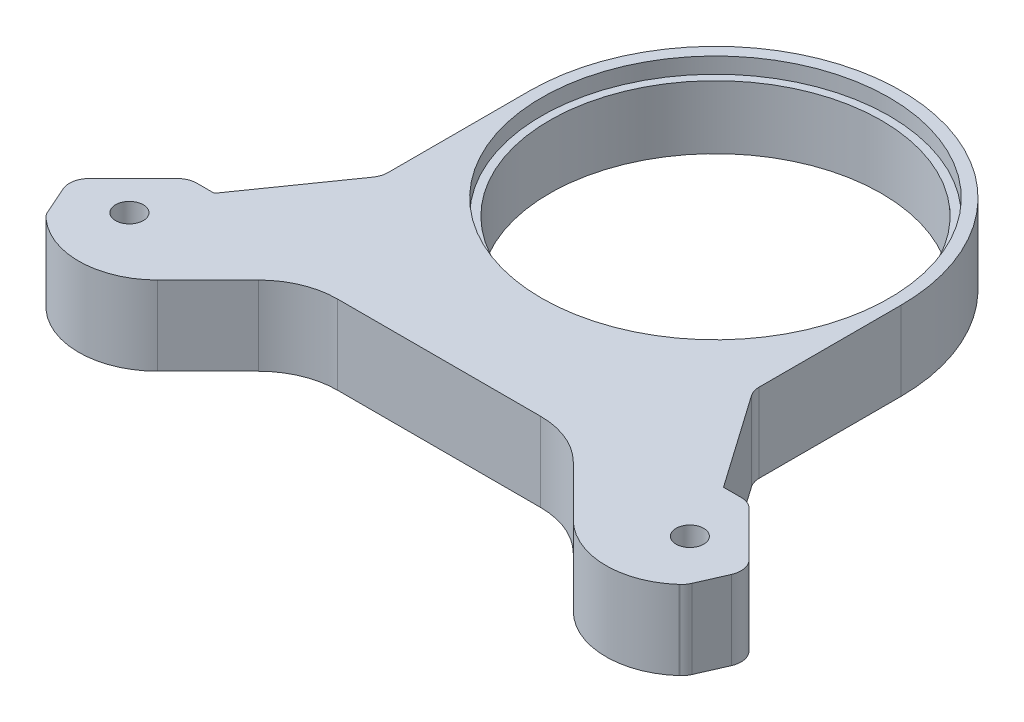
ISO-10303-21;
HEADER;
FILE_DESCRIPTION(('STEP AP214'),'2;1');
FILE_NAME('part.step','',(''),(''),'','','');
FILE_SCHEMA(('AUTOMOTIVE_DESIGN { 1 0 10303 214 1 1 1 1 }'));
ENDSEC;
DATA;
#1=APPLICATION_CONTEXT('core data for automotive mechanical design processes');
#2=APPLICATION_PROTOCOL_DEFINITION('international standard','automotive_design',2000,#1);
#3=PRODUCT_CONTEXT('',#1,'mechanical');
#4=PRODUCT('Part','Part','',(#3));
#5=PRODUCT_RELATED_PRODUCT_CATEGORY('part','',(#4));
#6=PRODUCT_DEFINITION_FORMATION('','',#4);
#7=PRODUCT_DEFINITION_CONTEXT('part definition',#1,'design');
#8=PRODUCT_DEFINITION('design','',#6,#7);
#9=PRODUCT_DEFINITION_SHAPE('','',#8);
#10=(LENGTH_UNIT() NAMED_UNIT(*) SI_UNIT(.MILLI.,.METRE.));
#11=(NAMED_UNIT(*) PLANE_ANGLE_UNIT() SI_UNIT($,.RADIAN.));
#12=(NAMED_UNIT(*) SI_UNIT($,.STERADIAN.) SOLID_ANGLE_UNIT());
#13=UNCERTAINTY_MEASURE_WITH_UNIT(LENGTH_MEASURE(1.E-05),#10,'distance_accuracy_value','');
#14=(GEOMETRIC_REPRESENTATION_CONTEXT(3) GLOBAL_UNCERTAINTY_ASSIGNED_CONTEXT((#13)) GLOBAL_UNIT_ASSIGNED_CONTEXT((#10,
#11,#12)) REPRESENTATION_CONTEXT('',''));
#15=CARTESIAN_POINT('',(0.,0.,0.));
#16=DIRECTION('',(0.,0.,1.));
#17=DIRECTION('',(1.,0.,0.));
#18=AXIS2_PLACEMENT_3D('',#15,#16,#17);
#19=CARTESIAN_POINT('',(0.,10.,0.));
#20=DIRECTION('',(0.,-1.,0.));
#21=DIRECTION('',(0.,0.,1.));
#22=AXIS2_PLACEMENT_3D('',#19,#20,#21);
#23=CYLINDRICAL_SURFACE('',#22,60.);
#24=CARTESIAN_POINT('',(0.,10.,0.));
#25=DIRECTION('',(0.,-1.,0.));
#26=DIRECTION('',(0.,0.,-1.));
#27=AXIS2_PLACEMENT_3D('',#24,#25,#26);
#28=CIRCLE('',#27,60.);
#29=CARTESIAN_POINT('',(-40.0484974665462,10.,44.6779347180691));
#30=VERTEX_POINT('',#29);
#31=CARTESIAN_POINT('',(-40.1334360134549,10.,44.6016514689078));
#32=VERTEX_POINT('',#31);
#33=EDGE_CURVE('E312',#30,#32,#28,.T.);
#34=ORIENTED_EDGE('',*,*,#33,.T.);
#35=DIRECTION('',(0.,-1.,0.));
#36=VECTOR('',#35,1.);
#37=CARTESIAN_POINT('',(-40.1334360134549,10.,44.6016514689078));
#38=LINE('',#37,#36);
#39=CARTESIAN_POINT('',(-40.1334360134549,0.,44.6016514689078));
#40=VERTEX_POINT('',#39);
#41=EDGE_CURVE('E398',#40,#32,#38,.F.);
#42=ORIENTED_EDGE('',*,*,#41,.F.);
#43=CARTESIAN_POINT('',(0.,0.,0.));
#44=DIRECTION('',(0.,-1.,0.));
#45=DIRECTION('',(0.,0.,-1.));
#46=AXIS2_PLACEMENT_3D('',#43,#44,#45);
#47=CIRCLE('',#46,60.);
#48=CARTESIAN_POINT('',(-40.0484974665462,0.,44.6779347180691));
#49=VERTEX_POINT('',#48);
#50=EDGE_CURVE('E286',#49,#40,#47,.T.);
#51=ORIENTED_EDGE('',*,*,#50,.F.);
#52=DIRECTION('',(0.,-1.,0.));
#53=VECTOR('',#52,1.);
#54=CARTESIAN_POINT('',(-40.0484974665462,10.,44.6779347180691));
#55=LINE('',#54,#53);
#56=EDGE_CURVE('E430',#30,#49,#55,.T.);
#57=ORIENTED_EDGE('',*,*,#56,.F.);
#58=EDGE_LOOP('',(#34,#42,#51,#57));
#59=FACE_BOUND('',#58,.T.);
#60=ADVANCED_FACE('F45',(#59),#23,.T.);
#61=CARTESIAN_POINT('',(0.,10.,0.));
#62=DIRECTION('',(0.,-1.,0.));
#63=DIRECTION('',(0.,0.,1.));
#64=AXIS2_PLACEMENT_3D('',#61,#62,#63);
#65=CYLINDRICAL_SURFACE('',#64,21.);
#66=CARTESIAN_POINT('',(0.,0.,0.));
#67=DIRECTION('',(0.,-1.,0.));
#68=DIRECTION('',(0.,0.,-1.));
#69=AXIS2_PLACEMENT_3D('',#66,#67,#68);
#70=CIRCLE('',#69,21.);
#71=CARTESIAN_POINT('',(0.,0.,-21.));
#72=VERTEX_POINT('',#71);
#73=EDGE_CURVE('E320',#72,#72,#70,.T.);
#74=ORIENTED_EDGE('',*,*,#73,.T.);
#75=EDGE_LOOP('',(#74));
#76=FACE_BOUND('',#75,.T.);
#77=CARTESIAN_POINT('',(0.,8.,0.));
#78=DIRECTION('',(0.,-1.,0.));
#79=DIRECTION('',(0.,0.,-1.));
#80=AXIS2_PLACEMENT_3D('',#77,#78,#79);
#81=CIRCLE('',#80,21.);
#82=CARTESIAN_POINT('',(0.,8.,-21.));
#83=VERTEX_POINT('',#82);
#84=EDGE_CURVE('E328',#83,#83,#81,.T.);
#85=ORIENTED_EDGE('',*,*,#84,.F.);
#86=EDGE_LOOP('',(#85));
#87=FACE_BOUND('',#86,.T.);
#88=ADVANCED_FACE('F579',(#76,#87),#65,.F.);
#89=CARTESIAN_POINT('',(-50.2677062284699,10.,22.1183201043049));
#90=DIRECTION('',(-0.91531147911944,0.,0.402746689858754));
#91=DIRECTION('',(-0.402746689858754,0.,-0.91531147911944));
#92=AXIS2_PLACEMENT_3D('',#89,#90,#91);
#93=PLANE('',#92);
#94=DIRECTION('',(0.402746689858754,0.,0.91531147911944));
#95=VECTOR('',#94,1.);
#96=CARTESIAN_POINT('',(-50.2677062284699,0.,22.1183201043049));
#97=LINE('',#96,#95);
#98=CARTESIAN_POINT('',(-42.2797149727628,0.,40.2724111882529));
#99=VERTEX_POINT('',#98);
#100=CARTESIAN_POINT('',(-40.7494882106929,0.,43.7501160490168));
#101=VERTEX_POINT('',#100);
#102=EDGE_CURVE('E285',#99,#101,#97,.T.);
#103=ORIENTED_EDGE('',*,*,#102,.T.);
#104=DIRECTION('',(0.,1.,0.));
#105=VECTOR('',#104,1.);
#106=CARTESIAN_POINT('',(-40.7494882106929,0.,43.7501160490168));
#107=LINE('',#106,#105);
#108=CARTESIAN_POINT('',(-40.7494882106929,10.,43.7501160490168));
#109=VERTEX_POINT('',#108);
#110=EDGE_CURVE('E392',#109,#101,#107,.F.);
#111=ORIENTED_EDGE('',*,*,#110,.F.);
#112=DIRECTION('',(0.402746689858754,0.,0.91531147911944));
#113=VECTOR('',#112,1.);
#114=CARTESIAN_POINT('',(-50.2677062284699,10.,22.1183201043049));
#115=LINE('',#114,#113);
#116=CARTESIAN_POINT('',(-42.2797149727628,10.,40.2724111882529));
#117=VERTEX_POINT('',#116);
#118=EDGE_CURVE('E262',#117,#109,#115,.T.);
#119=ORIENTED_EDGE('',*,*,#118,.F.);
#120=DIRECTION('',(0.,-1.,0.));
#121=VECTOR('',#120,1.);
#122=CARTESIAN_POINT('',(-42.2797149727628,10.,40.2724111882529));
#123=LINE('',#122,#121);
#124=EDGE_CURVE('E395',#99,#117,#123,.F.);
#125=ORIENTED_EDGE('',*,*,#124,.F.);
#126=EDGE_LOOP('',(#103,#111,#119,#125));
#127=FACE_BOUND('',#126,.T.);
#128=ADVANCED_FACE('F485',(#127),#93,.T.);
#129=CARTESIAN_POINT('',(-2.13071285864516,10.,-2.13071285864519));
#130=DIRECTION('',(-0.707106781186543,0.,-0.707106781186553));
#131=DIRECTION('',(0.707106781186553,0.,-0.707106781186543));
#132=AXIS2_PLACEMENT_3D('',#129,#130,#131);
#133=PLANE('',#132);
#134=DIRECTION('',(-0.707106781186553,0.,0.707106781186543));
#135=VECTOR('',#134,1.);
#136=CARTESIAN_POINT('',(-2.13071285864516,0.,-2.13071285864519));
#137=LINE('',#136,#135);
#138=CARTESIAN_POINT('',(-36.2007189468559,0.,31.9392932295651));
#139=VERTEX_POINT('',#138);
#140=CARTESIAN_POINT('',(-41.7592032279305,0.,37.4977775106396));
#141=VERTEX_POINT('',#140);
#142=EDGE_CURVE('E289',#139,#141,#137,.T.);
#143=ORIENTED_EDGE('',*,*,#142,.T.);
#144=DIRECTION('',(0.,-1.,0.));
#145=VECTOR('',#144,1.);
#146=CARTESIAN_POINT('',(-41.7592032279305,10.,37.4977775106396));
#147=LINE('',#146,#145);
#148=CARTESIAN_POINT('',(-41.7592032279305,10.,37.4977775106396));
#149=VERTEX_POINT('',#148);
#150=EDGE_CURVE('E386',#149,#141,#147,.T.);
#151=ORIENTED_EDGE('',*,*,#150,.F.);
#152=DIRECTION('',(-0.707106781186553,0.,0.707106781186543));
#153=VECTOR('',#152,1.);
#154=CARTESIAN_POINT('',(-2.13071285864516,10.,-2.13071285864519));
#155=LINE('',#154,#153);
#156=CARTESIAN_POINT('',(-36.2007189468559,10.,31.9392932295651));
#157=VERTEX_POINT('',#156);
#158=EDGE_CURVE('E259',#157,#149,#155,.T.);
#159=ORIENTED_EDGE('',*,*,#158,.F.);
#160=DIRECTION('',(0.,-1.,0.));
#161=VECTOR('',#160,1.);
#162=CARTESIAN_POINT('',(-36.2007189468559,10.,31.939293229565));
#163=LINE('',#162,#161);
#164=EDGE_CURVE('E389',#139,#157,#163,.F.);
#165=ORIENTED_EDGE('',*,*,#164,.F.);
#166=EDGE_LOOP('',(#143,#151,#159,#165));
#167=FACE_BOUND('',#166,.T.);
#168=ADVANCED_FACE('F571',(#167),#133,.T.);
#169=CARTESIAN_POINT('',(-3.00280142795347E-13,10.,31.2070601825318));
#170=DIRECTION('',(0.,0.,1.));
#171=DIRECTION('',(-1.,0.,0.));
#172=AXIS2_PLACEMENT_3D('',#169,#170,#171);
#173=PLANE('',#172);
#174=DIRECTION('',(1.,0.,0.));
#175=VECTOR('',#174,1.);
#176=CARTESIAN_POINT('',(-3.00280142795347E-13,10.,31.2070601825318));
#177=LINE('',#176,#175);
#178=CARTESIAN_POINT('',(-34.4329519938895,10.,31.2070601825314));
#179=VERTEX_POINT('',#178);
#180=CARTESIAN_POINT('',(-32.2233790159762,10.,31.2070601825314));
#181=VERTEX_POINT('',#180);
#182=EDGE_CURVE('E236',#179,#181,#177,.T.);
#183=ORIENTED_EDGE('',*,*,#182,.T.);
#184=DIRECTION('',(0.,-1.,0.));
#185=VECTOR('',#184,1.);
#186=CARTESIAN_POINT('',(-32.2233790159762,10.,31.2070601825314));
#187=LINE('',#186,#185);
#188=CARTESIAN_POINT('',(-32.2233790159762,0.,31.2070601825314));
#189=VERTEX_POINT('',#188);
#190=EDGE_CURVE('E245',#181,#189,#187,.T.);
#191=ORIENTED_EDGE('',*,*,#190,.T.);
#192=DIRECTION('',(1.,0.,0.));
#193=VECTOR('',#192,1.);
#194=CARTESIAN_POINT('',(-3.00280142795347E-13,0.,31.2070601825318));
#195=LINE('',#194,#193);
#196=CARTESIAN_POINT('',(-34.4329519938895,0.,31.2070601825314));
#197=VERTEX_POINT('',#196);
#198=EDGE_CURVE('E292',#197,#189,#195,.T.);
#199=ORIENTED_EDGE('',*,*,#198,.F.);
#200=DIRECTION('',(0.,-1.,0.));
#201=VECTOR('',#200,1.);
#202=CARTESIAN_POINT('',(-34.4329519938895,0.,31.2070601825314));
#203=LINE('',#202,#201);
#204=EDGE_CURVE('E258',#179,#197,#203,.T.);
#205=ORIENTED_EDGE('',*,*,#204,.F.);
#206=EDGE_LOOP('',(#183,#191,#199,#205));
#207=FACE_BOUND('',#206,.T.);
#208=ADVANCED_FACE('F256',(#207),#173,.F.);
#209=CARTESIAN_POINT('',(-6.95968977775582,10.,-4.87322724598562));
#210=DIRECTION('',(0.819152044288995,0.,0.573576436351041));
#211=DIRECTION('',(-0.573576436351041,0.,0.819152044288995));
#212=AXIS2_PLACEMENT_3D('',#209,#210,#211);
#213=PLANE('',#212);
#214=DIRECTION('',(0.573576436351041,0.,-0.819152044288995));
#215=VECTOR('',#214,1.);
#216=CARTESIAN_POINT('',(-6.95968977775582,0.,-4.87322724598562));
#217=LINE('',#216,#215);
#218=CARTESIAN_POINT('',(-23.9521198892775,0.,19.3944779474891));
#219=VERTEX_POINT('',#218);
#220=EDGE_CURVE('E248',#189,#219,#217,.T.);
#221=ORIENTED_EDGE('',*,*,#220,.F.);
#222=ORIENTED_EDGE('',*,*,#190,.F.);
#223=DIRECTION('',(0.573576436351041,0.,-0.819152044288995));
#224=VECTOR('',#223,1.);
#225=CARTESIAN_POINT('',(-6.95968977775582,10.,-4.87322724598562));
#226=LINE('',#225,#224);
#227=CARTESIAN_POINT('',(-23.9521198892775,10.,19.3944779474891));
#228=VERTEX_POINT('',#227);
#229=EDGE_CURVE('E230',#181,#228,#226,.T.);
#230=ORIENTED_EDGE('',*,*,#229,.T.);
#231=DIRECTION('',(0.,-1.,0.));
#232=VECTOR('',#231,1.);
#233=CARTESIAN_POINT('',(-23.9521198892775,10.,19.3944779474891));
#234=LINE('',#233,#232);
#235=EDGE_CURVE('E383',#219,#228,#234,.F.);
#236=ORIENTED_EDGE('',*,*,#235,.F.);
#237=EDGE_LOOP('',(#221,#222,#230,#236));
#238=FACE_BOUND('',#237,.T.);
#239=ADVANCED_FACE('F246',(#238),#213,.F.);
#240=CARTESIAN_POINT('',(-23.5,10.,0.));
#241=DIRECTION('',(-1.,0.,0.));
#242=DIRECTION('',(0.,0.,-1.));
#243=AXIS2_PLACEMENT_3D('',#240,#241,#242);
#244=PLANE('',#243);
#245=DIRECTION('',(0.,0.,1.));
#246=VECTOR('',#245,1.);
#247=CARTESIAN_POINT('',(-23.5,10.,0.));
#248=LINE('',#247,#246);
#249=CARTESIAN_POINT('',(-23.5,10.,0.));
#250=VERTEX_POINT('',#249);
#251=CARTESIAN_POINT('',(-23.5,10.,17.9605368566115));
#252=VERTEX_POINT('',#251);
#253=EDGE_CURVE('E242',#250,#252,#248,.T.);
#254=ORIENTED_EDGE('',*,*,#253,.F.);
#255=DIRECTION('',(0.,-1.,0.));
#256=VECTOR('',#255,1.);
#257=CARTESIAN_POINT('',(-23.5,10.,0.));
#258=LINE('',#257,#256);
#259=CARTESIAN_POINT('',(-23.5,0.,0.));
#260=VERTEX_POINT('',#259);
#261=EDGE_CURVE('E253',#250,#260,#258,.T.);
#262=ORIENTED_EDGE('',*,*,#261,.T.);
#263=DIRECTION('',(0.,0.,1.));
#264=VECTOR('',#263,1.);
#265=CARTESIAN_POINT('',(-23.5,0.,0.));
#266=LINE('',#265,#264);
#267=CARTESIAN_POINT('',(-23.5,0.,17.9605368566115));
#268=VERTEX_POINT('',#267);
#269=EDGE_CURVE('E295',#260,#268,#266,.T.);
#270=ORIENTED_EDGE('',*,*,#269,.T.);
#271=DIRECTION('',(0.,-1.,0.));
#272=VECTOR('',#271,1.);
#273=CARTESIAN_POINT('',(-23.5,10.,17.9605368566115));
#274=LINE('',#273,#272);
#275=EDGE_CURVE('E380',#252,#268,#274,.T.);
#276=ORIENTED_EDGE('',*,*,#275,.F.);
#277=EDGE_LOOP('',(#254,#262,#270,#276));
#278=FACE_BOUND('',#277,.T.);
#279=ADVANCED_FACE('F561',(#278),#244,.T.);
#280=CARTESIAN_POINT('',(23.5,10.,0.));
#281=DIRECTION('',(-1.,0.,0.));
#282=DIRECTION('',(0.,0.,-1.));
#283=AXIS2_PLACEMENT_3D('',#280,#281,#282);
#284=PLANE('',#283);
#285=DIRECTION('',(0.,0.,1.));
#286=VECTOR('',#285,1.);
#287=CARTESIAN_POINT('',(23.5,0.,0.));
#288=LINE('',#287,#286);
#289=CARTESIAN_POINT('',(23.5,0.,0.));
#290=VERTEX_POINT('',#289);
#291=CARTESIAN_POINT('',(23.5,0.,17.9605368566115));
#292=VERTEX_POINT('',#291);
#293=EDGE_CURVE('E298',#290,#292,#288,.T.);
#294=ORIENTED_EDGE('',*,*,#293,.F.);
#295=DIRECTION('',(0.,-1.,0.));
#296=VECTOR('',#295,1.);
#297=CARTESIAN_POINT('',(23.5,10.,0.));
#298=LINE('',#297,#296);
#299=CARTESIAN_POINT('',(23.5,10.,0.));
#300=VERTEX_POINT('',#299);
#301=EDGE_CURVE('E315',#300,#290,#298,.T.);
#302=ORIENTED_EDGE('',*,*,#301,.F.);
#303=DIRECTION('',(0.,0.,1.));
#304=VECTOR('',#303,1.);
#305=CARTESIAN_POINT('',(23.5,10.,0.));
#306=LINE('',#305,#304);
#307=CARTESIAN_POINT('',(23.5,10.,17.9605368566115));
#308=VERTEX_POINT('',#307);
#309=EDGE_CURVE('E267',#300,#308,#306,.T.);
#310=ORIENTED_EDGE('',*,*,#309,.T.);
#311=DIRECTION('',(0.,-1.,0.));
#312=VECTOR('',#311,1.);
#313=CARTESIAN_POINT('',(23.5,10.,17.9605368566115));
#314=LINE('',#313,#312);
#315=EDGE_CURVE('E377',#292,#308,#314,.F.);
#316=ORIENTED_EDGE('',*,*,#315,.F.);
#317=EDGE_LOOP('',(#294,#302,#310,#316));
#318=FACE_BOUND('',#317,.T.);
#319=ADVANCED_FACE('F553',(#318),#284,.F.);
#320=CARTESIAN_POINT('',(6.95968977775582,10.,-4.87322724598562));
#321=DIRECTION('',(0.819152044288995,0.,-0.573576436351041));
#322=DIRECTION('',(0.573576436351041,0.,0.819152044288995));
#323=AXIS2_PLACEMENT_3D('',#320,#321,#322);
#324=PLANE('',#323);
#325=DIRECTION('',(-0.573576436351041,0.,-0.819152044288995));
#326=VECTOR('',#325,1.);
#327=CARTESIAN_POINT('',(6.95968977775582,10.,-4.87322724598562));
#328=LINE('',#327,#326);
#329=CARTESIAN_POINT('',(32.2233790159762,10.,31.2070601825314));
#330=VERTEX_POINT('',#329);
#331=CARTESIAN_POINT('',(23.9521198892775,10.,19.3944779474891));
#332=VERTEX_POINT('',#331);
#333=EDGE_CURVE('E270',#330,#332,#328,.T.);
#334=ORIENTED_EDGE('',*,*,#333,.F.);
#335=DIRECTION('',(0.,-1.,0.));
#336=VECTOR('',#335,1.);
#337=CARTESIAN_POINT('',(32.2233790159762,10.,31.2070601825314));
#338=LINE('',#337,#336);
#339=CARTESIAN_POINT('',(32.2233790159762,0.,31.2070601825314));
#340=VERTEX_POINT('',#339);
#341=EDGE_CURVE('E281',#330,#340,#338,.T.);
#342=ORIENTED_EDGE('',*,*,#341,.T.);
#343=DIRECTION('',(-0.573576436351041,0.,-0.819152044288995));
#344=VECTOR('',#343,1.);
#345=CARTESIAN_POINT('',(6.95968977775582,0.,-4.87322724598562));
#346=LINE('',#345,#344);
#347=CARTESIAN_POINT('',(23.9521198892775,0.,19.3944779474891));
#348=VERTEX_POINT('',#347);
#349=EDGE_CURVE('E301',#340,#348,#346,.T.);
#350=ORIENTED_EDGE('',*,*,#349,.T.);
#351=DIRECTION('',(0.,-1.,0.));
#352=VECTOR('',#351,1.);
#353=CARTESIAN_POINT('',(23.9521198892775,10.,19.3944779474891));
#354=LINE('',#353,#352);
#355=EDGE_CURVE('E374',#332,#348,#354,.T.);
#356=ORIENTED_EDGE('',*,*,#355,.F.);
#357=EDGE_LOOP('',(#334,#342,#350,#356));
#358=FACE_BOUND('',#357,.T.);
#359=ADVANCED_FACE('F545',(#358),#324,.T.);
#360=CARTESIAN_POINT('',(0.,10.,31.2070601825315));
#361=DIRECTION('',(0.,0.,-1.));
#362=DIRECTION('',(1.,0.,0.));
#363=AXIS2_PLACEMENT_3D('',#360,#361,#362);
#364=PLANE('',#363);
#365=DIRECTION('',(-1.,0.,0.));
#366=VECTOR('',#365,1.);
#367=CARTESIAN_POINT('',(0.,0.,31.2070601825315));
#368=LINE('',#367,#366);
#369=CARTESIAN_POINT('',(34.4329519938894,0.,31.2070601825314));
#370=VERTEX_POINT('',#369);
#371=EDGE_CURVE('E304',#370,#340,#368,.T.);
#372=ORIENTED_EDGE('',*,*,#371,.T.);
#373=ORIENTED_EDGE('',*,*,#341,.F.);
#374=DIRECTION('',(-1.,0.,0.));
#375=VECTOR('',#374,1.);
#376=CARTESIAN_POINT('',(0.,10.,31.2070601825315));
#377=LINE('',#376,#375);
#378=CARTESIAN_POINT('',(34.4329519938894,10.,31.2070601825314));
#379=VERTEX_POINT('',#378);
#380=EDGE_CURVE('E273',#379,#330,#377,.T.);
#381=ORIENTED_EDGE('',*,*,#380,.F.);
#382=DIRECTION('',(0.,-1.,0.));
#383=VECTOR('',#382,1.);
#384=CARTESIAN_POINT('',(34.4329519938894,10.,31.2070601825314));
#385=LINE('',#384,#383);
#386=EDGE_CURVE('E371',#370,#379,#385,.F.);
#387=ORIENTED_EDGE('',*,*,#386,.F.);
#388=EDGE_LOOP('',(#372,#373,#381,#387));
#389=FACE_BOUND('',#388,.T.);
#390=ADVANCED_FACE('F540',(#389),#364,.T.);
#391=CARTESIAN_POINT('',(2.13071285864504,10.,-2.13071285864508));
#392=DIRECTION('',(-0.707106781186541,0.,0.707106781186554));
#393=DIRECTION('',(-0.707106781186554,0.,-0.707106781186541));
#394=AXIS2_PLACEMENT_3D('',#391,#392,#393);
#395=PLANE('',#394);
#396=DIRECTION('',(0.707106781186554,0.,0.707106781186541));
#397=VECTOR('',#396,1.);
#398=CARTESIAN_POINT('',(2.13071285864504,0.,-2.13071285864508));
#399=LINE('',#398,#397);
#400=CARTESIAN_POINT('',(36.2007189468558,0.,31.9392932295651));
#401=VERTEX_POINT('',#400);
#402=CARTESIAN_POINT('',(41.7592032279304,0.,37.4977775106396));
#403=VERTEX_POINT('',#402);
#404=EDGE_CURVE('E306',#401,#403,#399,.T.);
#405=ORIENTED_EDGE('',*,*,#404,.F.);
#406=DIRECTION('',(0.,-1.,0.));
#407=VECTOR('',#406,1.);
#408=CARTESIAN_POINT('',(36.2007189468558,0.,31.9392932295651));
#409=LINE('',#408,#407);
#410=CARTESIAN_POINT('',(36.2007189468558,10.,31.9392932295651));
#411=VERTEX_POINT('',#410);
#412=EDGE_CURVE('E365',#411,#401,#409,.T.);
#413=ORIENTED_EDGE('',*,*,#412,.F.);
#414=DIRECTION('',(0.707106781186554,0.,0.707106781186541));
#415=VECTOR('',#414,1.);
#416=CARTESIAN_POINT('',(2.13071285864504,10.,-2.13071285864508));
#417=LINE('',#416,#415);
#418=CARTESIAN_POINT('',(41.7592032279304,10.,37.4977775106396));
#419=VERTEX_POINT('',#418);
#420=EDGE_CURVE('E275',#411,#419,#417,.T.);
#421=ORIENTED_EDGE('',*,*,#420,.T.);
#422=DIRECTION('',(0.,-1.,0.));
#423=VECTOR('',#422,1.);
#424=CARTESIAN_POINT('',(41.7592032279304,10.,37.4977775106396));
#425=LINE('',#424,#423);
#426=EDGE_CURVE('E368',#403,#419,#425,.F.);
#427=ORIENTED_EDGE('',*,*,#426,.F.);
#428=EDGE_LOOP('',(#405,#413,#421,#427));
#429=FACE_BOUND('',#428,.T.);
#430=ADVANCED_FACE('F532',(#429),#395,.F.);
#431=CARTESIAN_POINT('',(50.2677062284698,10.,22.1183201043035));
#432=DIRECTION('',(-0.915311479119449,0.,-0.402746689858733));
#433=DIRECTION('',(0.402746689858733,0.,-0.915311479119449));
#434=AXIS2_PLACEMENT_3D('',#431,#432,#433);
#435=PLANE('',#434);
#436=DIRECTION('',(-0.402746689858733,0.,0.915311479119449));
#437=VECTOR('',#436,1.);
#438=CARTESIAN_POINT('',(50.2677062284698,0.,22.1183201043035));
#439=LINE('',#438,#437);
#440=CARTESIAN_POINT('',(42.2797149727627,0.,40.2724111882528));
#441=VERTEX_POINT('',#440);
#442=CARTESIAN_POINT('',(40.7494882106929,0.,43.7501160490168));
#443=VERTEX_POINT('',#442);
#444=EDGE_CURVE('E309',#441,#443,#439,.T.);
#445=ORIENTED_EDGE('',*,*,#444,.F.);
#446=DIRECTION('',(0.,-1.,0.));
#447=VECTOR('',#446,1.);
#448=CARTESIAN_POINT('',(42.2797149727627,10.,40.2724111882528));
#449=LINE('',#448,#447);
#450=CARTESIAN_POINT('',(42.2797149727627,10.,40.2724111882528));
#451=VERTEX_POINT('',#450);
#452=EDGE_CURVE('E347',#451,#441,#449,.T.);
#453=ORIENTED_EDGE('',*,*,#452,.F.);
#454=DIRECTION('',(-0.402746689858733,0.,0.915311479119449));
#455=VECTOR('',#454,1.);
#456=CARTESIAN_POINT('',(50.2677062284698,10.,22.1183201043035));
#457=LINE('',#456,#455);
#458=CARTESIAN_POINT('',(40.7494882106929,10.,43.7501160490168));
#459=VERTEX_POINT('',#458);
#460=EDGE_CURVE('E278',#451,#459,#457,.T.);
#461=ORIENTED_EDGE('',*,*,#460,.T.);
#462=DIRECTION('',(0.,-1.,0.));
#463=VECTOR('',#462,1.);
#464=CARTESIAN_POINT('',(40.7494882106929,10.,43.7501160490168));
#465=LINE('',#464,#463);
#466=EDGE_CURVE('E350',#443,#459,#465,.F.);
#467=ORIENTED_EDGE('',*,*,#466,.F.);
#468=EDGE_LOOP('',(#445,#453,#461,#467));
#469=FACE_BOUND('',#468,.T.);
#470=ADVANCED_FACE('F524',(#469),#435,.F.);
#471=CARTESIAN_POINT('',(40.1334360134549,0.,44.6016514689078));
#472=VERTEX_POINT('',#471);
#473=CARTESIAN_POINT('',(40.0484974665462,0.,44.6779347180691));
#474=VERTEX_POINT('',#473);
#475=EDGE_CURVE('E282',#472,#474,#47,.T.);
#476=ORIENTED_EDGE('',*,*,#475,.F.);
#477=DIRECTION('',(0.,-1.,0.));
#478=VECTOR('',#477,1.);
#479=CARTESIAN_POINT('',(40.1334360134549,10.,44.6016514689078));
#480=LINE('',#479,#478);
#481=CARTESIAN_POINT('',(40.1334360134549,10.,44.6016514689078));
#482=VERTEX_POINT('',#481);
#483=EDGE_CURVE('E252',#482,#472,#480,.T.);
#484=ORIENTED_EDGE('',*,*,#483,.F.);
#485=CARTESIAN_POINT('',(40.0484974665462,10.,44.6779347180691));
#486=VERTEX_POINT('',#485);
#487=EDGE_CURVE('E477',#482,#486,#28,.T.);
#488=ORIENTED_EDGE('',*,*,#487,.T.);
#489=DIRECTION('',(0.,-1.,0.));
#490=VECTOR('',#489,1.);
#491=CARTESIAN_POINT('',(40.0484974665462,10.,44.6779347180691));
#492=LINE('',#491,#490);
#493=EDGE_CURVE('E416',#474,#486,#492,.F.);
#494=ORIENTED_EDGE('',*,*,#493,.F.);
#495=EDGE_LOOP('',(#476,#484,#488,#494));
#496=FACE_BOUND('',#495,.T.);
#497=ADVANCED_FACE('F515',(#496),#23,.T.);
#498=CARTESIAN_POINT('',(0.,0.,0.));
#499=DIRECTION('',(0.,1.,0.));
#500=DIRECTION('',(0.,0.,-1.));
#501=AXIS2_PLACEMENT_3D('',#498,#499,#500);
#502=PLANE('',#501);
#503=CARTESIAN_POINT('',(-35.4684858998222,0.,38.7070601825314));
#504=DIRECTION('',(0.,-1.,0.));
#505=DIRECTION('',(0.,0.,-1.));
#506=AXIS2_PLACEMENT_3D('',#503,#504,#505);
#507=CIRCLE('',#506,1.75);
#508=CARTESIAN_POINT('',(-35.4684858998222,0.,36.9570601825314));
#509=VERTEX_POINT('',#508);
#510=EDGE_CURVE('E324',#509,#509,#507,.F.);
#511=ORIENTED_EDGE('',*,*,#510,.T.);
#512=EDGE_LOOP('',(#511));
#513=FACE_BOUND('',#512,.T.);
#514=CARTESIAN_POINT('',(35.4684858998222,0.,38.7070601825314));
#515=DIRECTION('',(0.,-1.,0.));
#516=DIRECTION('',(0.,0.,-1.));
#517=AXIS2_PLACEMENT_3D('',#514,#515,#516);
#518=CIRCLE('',#517,1.75);
#519=CARTESIAN_POINT('',(35.4684858998222,0.,36.9570601825314));
#520=VERTEX_POINT('',#519);
#521=EDGE_CURVE('E331',#520,#520,#518,.F.);
#522=ORIENTED_EDGE('',*,*,#521,.T.);
#523=EDGE_LOOP('',(#522));
#524=FACE_BOUND('',#523,.T.);
#525=DIRECTION('',(-0.707106781186546,0.,-0.707106781186549));
#526=VECTOR('',#525,1.);
#527=CARTESIAN_POINT('',(17.,0.,35.));
#528=LINE('',#527,#526);
#529=CARTESIAN_POINT('',(26.302680076923,0.,44.302680076923));
#530=VERTEX_POINT('',#529);
#531=CARTESIAN_POINT('',(19.9289321881345,0.,37.9289321881345));
#532=VERTEX_POINT('',#531);
#533=EDGE_CURVE('E454',#530,#532,#528,.T.);
#534=ORIENTED_EDGE('',*,*,#533,.T.);
#535=CARTESIAN_POINT('',(12.857864376269,0.,45.));
#536=DIRECTION('',(0.,-1.,0.));
#537=DIRECTION('',(0.,0.,-1.));
#538=AXIS2_PLACEMENT_3D('',#535,#536,#537);
#539=CIRCLE('',#538,10.);
#540=CARTESIAN_POINT('',(12.857864376269,0.,35.));
#541=VERTEX_POINT('',#540);
#542=EDGE_CURVE('E432',#541,#532,#539,.T.);
#543=ORIENTED_EDGE('',*,*,#542,.F.);
#544=DIRECTION('',(-1.,0.,0.));
#545=VECTOR('',#544,1.);
#546=CARTESIAN_POINT('',(17.,0.,35.));
#547=LINE('',#546,#545);
#548=CARTESIAN_POINT('',(-12.857864376269,0.,35.));
#549=VERTEX_POINT('',#548);
#550=EDGE_CURVE('E448',#541,#549,#547,.T.);
#551=ORIENTED_EDGE('',*,*,#550,.T.);
#552=CARTESIAN_POINT('',(-12.857864376269,0.,45.));
#553=DIRECTION('',(0.,-1.,0.));
#554=DIRECTION('',(0.,0.,-1.));
#555=AXIS2_PLACEMENT_3D('',#552,#553,#554);
#556=CIRCLE('',#555,10.);
#557=CARTESIAN_POINT('',(-19.9289321881345,0.,37.9289321881345));
#558=VERTEX_POINT('',#557);
#559=EDGE_CURVE('E53',#558,#549,#556,.T.);
#560=ORIENTED_EDGE('',*,*,#559,.F.);
#561=DIRECTION('',(-0.707106781186546,0.,0.707106781186549));
#562=VECTOR('',#561,1.);
#563=CARTESIAN_POINT('',(-17.,0.,35.));
#564=LINE('',#563,#562);
#565=CARTESIAN_POINT('',(-26.302680076923,0.,44.302680076923));
#566=VERTEX_POINT('',#565);
#567=EDGE_CURVE('E453',#558,#566,#564,.T.);
#568=ORIENTED_EDGE('',*,*,#567,.T.);
#569=CARTESIAN_POINT('',(-33.3737478887885,0.,37.2316122650576));
#570=DIRECTION('',(0.,-1.,0.));
#571=DIRECTION('',(0.,0.,-1.));
#572=AXIS2_PLACEMENT_3D('',#569,#570,#571);
#573=CIRCLE('',#572,10.);
#574=EDGE_CURVE('E412',#49,#566,#573,.F.);
#575=ORIENTED_EDGE('',*,*,#574,.F.);
#576=ORIENTED_EDGE('',*,*,#50,.T.);
#577=CARTESIAN_POINT('',(-38.4612095128943,0.,42.7432493243699));
#578=DIRECTION('',(0.,-1.,0.));
#579=DIRECTION('',(0.,0.,-1.));
#580=AXIS2_PLACEMENT_3D('',#577,#578,#579);
#581=CIRCLE('',#580,2.5);
#582=EDGE_CURVE('E335',#101,#40,#581,.F.);
#583=ORIENTED_EDGE('',*,*,#582,.F.);
#584=ORIENTED_EDGE('',*,*,#102,.F.);
#585=CARTESIAN_POINT('',(-39.9914362749642,0.,39.265544463606));
#586=DIRECTION('',(0.,-1.,0.));
#587=DIRECTION('',(0.,0.,-1.));
#588=AXIS2_PLACEMENT_3D('',#585,#586,#587);
#589=CIRCLE('',#588,2.5);
#590=EDGE_CURVE('E337',#141,#99,#589,.F.);
#591=ORIENTED_EDGE('',*,*,#590,.F.);
#592=ORIENTED_EDGE('',*,*,#142,.F.);
#593=CARTESIAN_POINT('',(-34.4329519938895,0.,33.7070601825314));
#594=DIRECTION('',(0.,-1.,0.));
#595=DIRECTION('',(0.,0.,-1.));
#596=AXIS2_PLACEMENT_3D('',#593,#594,#595);
#597=CIRCLE('',#596,2.5);
#598=EDGE_CURVE('E339',#197,#139,#597,.F.);
#599=ORIENTED_EDGE('',*,*,#598,.F.);
#600=ORIENTED_EDGE('',*,*,#198,.T.);
#601=ORIENTED_EDGE('',*,*,#220,.T.);
#602=CARTESIAN_POINT('',(-26.,0.,17.9605368566115));
#603=DIRECTION('',(0.,-1.,0.));
#604=DIRECTION('',(0.,0.,-1.));
#605=AXIS2_PLACEMENT_3D('',#602,#603,#604);
#606=CIRCLE('',#605,2.5);
#607=EDGE_CURVE('E405',#268,#219,#606,.T.);
#608=ORIENTED_EDGE('',*,*,#607,.F.);
#609=ORIENTED_EDGE('',*,*,#269,.F.);
#610=CARTESIAN_POINT('',(0.,0.,0.));
#611=DIRECTION('',(0.,-1.,0.));
#612=DIRECTION('',(0.,0.,-1.));
#613=AXIS2_PLACEMENT_3D('',#610,#611,#612);
#614=CIRCLE('',#613,23.5);
#615=EDGE_CURVE('E323',#260,#290,#614,.T.);
#616=ORIENTED_EDGE('',*,*,#615,.T.);
#617=ORIENTED_EDGE('',*,*,#293,.T.);
#618=CARTESIAN_POINT('',(26.,0.,17.9605368566115));
#619=DIRECTION('',(0.,-1.,0.));
#620=DIRECTION('',(0.,0.,-1.));
#621=AXIS2_PLACEMENT_3D('',#618,#619,#620);
#622=CIRCLE('',#621,2.5);
#623=EDGE_CURVE('E401',#348,#292,#622,.T.);
#624=ORIENTED_EDGE('',*,*,#623,.F.);
#625=ORIENTED_EDGE('',*,*,#349,.F.);
#626=ORIENTED_EDGE('',*,*,#371,.F.);
#627=CARTESIAN_POINT('',(34.4329519938894,0.,33.7070601825314));
#628=DIRECTION('',(0.,-1.,0.));
#629=DIRECTION('',(0.,0.,-1.));
#630=AXIS2_PLACEMENT_3D('',#627,#628,#629);
#631=CIRCLE('',#630,2.5);
#632=EDGE_CURVE('E341',#401,#370,#631,.F.);
#633=ORIENTED_EDGE('',*,*,#632,.F.);
#634=ORIENTED_EDGE('',*,*,#404,.T.);
#635=CARTESIAN_POINT('',(39.9914362749641,0.,39.265544463606));
#636=DIRECTION('',(0.,-1.,0.));
#637=DIRECTION('',(0.,0.,-1.));
#638=AXIS2_PLACEMENT_3D('',#635,#636,#637);
#639=CIRCLE('',#638,2.5);
#640=EDGE_CURVE('E343',#441,#403,#639,.F.);
#641=ORIENTED_EDGE('',*,*,#640,.F.);
#642=ORIENTED_EDGE('',*,*,#444,.T.);
#643=CARTESIAN_POINT('',(38.4612095128942,0.,42.74324932437));
#644=DIRECTION('',(0.,-1.,0.));
#645=DIRECTION('',(0.,0.,-1.));
#646=AXIS2_PLACEMENT_3D('',#643,#644,#645);
#647=CIRCLE('',#646,2.5);
#648=EDGE_CURVE('E345',#472,#443,#647,.F.);
#649=ORIENTED_EDGE('',*,*,#648,.F.);
#650=ORIENTED_EDGE('',*,*,#475,.T.);
#651=CARTESIAN_POINT('',(33.3737478887885,0.,37.2316122650576));
#652=DIRECTION('',(0.,-1.,0.));
#653=DIRECTION('',(0.,0.,-1.));
#654=AXIS2_PLACEMENT_3D('',#651,#652,#653);
#655=CIRCLE('',#654,10.);
#656=EDGE_CURVE('E414',#530,#474,#655,.F.);
#657=ORIENTED_EDGE('',*,*,#656,.F.);
#658=EDGE_LOOP('',(#534,#543,#551,#560,#568,#575,#576,#583,#584,#591,#592,#599,#600,#601,#608,
#609,#616,#617,#624,#625,#626,#633,#634,#641,#642,#649,#650,#657));
#659=FACE_BOUND('',#658,.T.);
#660=ORIENTED_EDGE('',*,*,#73,.F.);
#661=EDGE_LOOP('',(#660));
#662=FACE_BOUND('',#661,.T.);
#663=ADVANCED_FACE('F450',(#513,#524,#659,#662),#502,.F.);
#664=CARTESIAN_POINT('',(0.,10.,0.));
#665=DIRECTION('',(0.,1.,0.));
#666=DIRECTION('',(0.,0.,-1.));
#667=AXIS2_PLACEMENT_3D('',#664,#665,#666);
#668=PLANE('',#667);
#669=ORIENTED_EDGE('',*,*,#487,.F.);
#670=CARTESIAN_POINT('',(38.4612095128942,10.,42.74324932437));
#671=DIRECTION('',(0.,-1.,0.));
#672=DIRECTION('',(0.,0.,-1.));
#673=AXIS2_PLACEMENT_3D('',#670,#671,#672);
#674=CIRCLE('',#673,2.5);
#675=EDGE_CURVE('E363',#459,#482,#674,.T.);
#676=ORIENTED_EDGE('',*,*,#675,.F.);
#677=ORIENTED_EDGE('',*,*,#460,.F.);
#678=CARTESIAN_POINT('',(39.9914362749641,10.,39.265544463606));
#679=DIRECTION('',(0.,-1.,0.));
#680=DIRECTION('',(0.,0.,-1.));
#681=AXIS2_PLACEMENT_3D('',#678,#679,#680);
#682=CIRCLE('',#681,2.5);
#683=EDGE_CURVE('E361',#419,#451,#682,.T.);
#684=ORIENTED_EDGE('',*,*,#683,.F.);
#685=ORIENTED_EDGE('',*,*,#420,.F.);
#686=CARTESIAN_POINT('',(34.4329519938894,10.,33.7070601825314));
#687=DIRECTION('',(0.,-1.,0.));
#688=DIRECTION('',(0.,0.,-1.));
#689=AXIS2_PLACEMENT_3D('',#686,#687,#688);
#690=CIRCLE('',#689,2.5);
#691=EDGE_CURVE('E359',#379,#411,#690,.T.);
#692=ORIENTED_EDGE('',*,*,#691,.F.);
#693=ORIENTED_EDGE('',*,*,#380,.T.);
#694=ORIENTED_EDGE('',*,*,#333,.T.);
#695=CARTESIAN_POINT('',(26.,10.,17.9605368566115));
#696=DIRECTION('',(0.,-1.,0.));
#697=DIRECTION('',(0.,0.,-1.));
#698=AXIS2_PLACEMENT_3D('',#695,#696,#697);
#699=CIRCLE('',#698,2.5);
#700=EDGE_CURVE('E403',#308,#332,#699,.F.);
#701=ORIENTED_EDGE('',*,*,#700,.F.);
#702=ORIENTED_EDGE('',*,*,#309,.F.);
#703=CARTESIAN_POINT('',(0.,10.,0.));
#704=DIRECTION('',(0.,-1.,0.));
#705=DIRECTION('',(0.,0.,-1.));
#706=AXIS2_PLACEMENT_3D('',#703,#704,#705);
#707=CIRCLE('',#706,23.5);
#708=EDGE_CURVE('E325',#250,#300,#707,.T.);
#709=ORIENTED_EDGE('',*,*,#708,.F.);
#710=ORIENTED_EDGE('',*,*,#253,.T.);
#711=CARTESIAN_POINT('',(-26.,10.,17.9605368566115));
#712=DIRECTION('',(0.,-1.,0.));
#713=DIRECTION('',(0.,0.,-1.));
#714=AXIS2_PLACEMENT_3D('',#711,#712,#713);
#715=CIRCLE('',#714,2.5);
#716=EDGE_CURVE('E238',#228,#252,#715,.F.);
#717=ORIENTED_EDGE('',*,*,#716,.F.);
#718=ORIENTED_EDGE('',*,*,#229,.F.);
#719=ORIENTED_EDGE('',*,*,#182,.F.);
#720=CARTESIAN_POINT('',(-34.4329519938895,10.,33.7070601825314));
#721=DIRECTION('',(0.,-1.,0.));
#722=DIRECTION('',(0.,0.,-1.));
#723=AXIS2_PLACEMENT_3D('',#720,#721,#722);
#724=CIRCLE('',#723,2.5);
#725=EDGE_CURVE('E357',#157,#179,#724,.T.);
#726=ORIENTED_EDGE('',*,*,#725,.F.);
#727=ORIENTED_EDGE('',*,*,#158,.T.);
#728=CARTESIAN_POINT('',(-39.9914362749642,10.,39.265544463606));
#729=DIRECTION('',(0.,-1.,0.));
#730=DIRECTION('',(0.,0.,-1.));
#731=AXIS2_PLACEMENT_3D('',#728,#729,#730);
#732=CIRCLE('',#731,2.5);
#733=EDGE_CURVE('E355',#117,#149,#732,.T.);
#734=ORIENTED_EDGE('',*,*,#733,.F.);
#735=ORIENTED_EDGE('',*,*,#118,.T.);
#736=CARTESIAN_POINT('',(-38.4612095128943,10.,42.7432493243699));
#737=DIRECTION('',(0.,-1.,0.));
#738=DIRECTION('',(0.,0.,-1.));
#739=AXIS2_PLACEMENT_3D('',#736,#737,#738);
#740=CIRCLE('',#739,2.5);
#741=EDGE_CURVE('E353',#32,#109,#740,.T.);
#742=ORIENTED_EDGE('',*,*,#741,.F.);
#743=ORIENTED_EDGE('',*,*,#33,.F.);
#744=CARTESIAN_POINT('',(-33.3737478887885,10.,37.2316122650576));
#745=DIRECTION('',(0.,-1.,0.));
#746=DIRECTION('',(0.,0.,-1.));
#747=AXIS2_PLACEMENT_3D('',#744,#745,#746);
#748=CIRCLE('',#747,10.);
#749=CARTESIAN_POINT('',(-26.302680076923,10.,44.302680076923));
#750=VERTEX_POINT('',#749);
#751=EDGE_CURVE('E60',#750,#30,#748,.T.);
#752=ORIENTED_EDGE('',*,*,#751,.F.);
#753=DIRECTION('',(-0.707106781186546,0.,0.707106781186549));
#754=VECTOR('',#753,1.);
#755=CARTESIAN_POINT('',(-17.,10.,35.));
#756=LINE('',#755,#754);
#757=CARTESIAN_POINT('',(-19.9289321881345,10.,37.9289321881345));
#758=VERTEX_POINT('',#757);
#759=EDGE_CURVE('E466',#758,#750,#756,.T.);
#760=ORIENTED_EDGE('',*,*,#759,.F.);
#761=CARTESIAN_POINT('',(-12.857864376269,10.,45.));
#762=DIRECTION('',(0.,-1.,0.));
#763=DIRECTION('',(0.,0.,-1.));
#764=AXIS2_PLACEMENT_3D('',#761,#762,#763);
#765=CIRCLE('',#764,10.);
#766=CARTESIAN_POINT('',(-12.857864376269,10.,35.));
#767=VERTEX_POINT('',#766);
#768=EDGE_CURVE('E11',#767,#758,#765,.F.);
#769=ORIENTED_EDGE('',*,*,#768,.F.);
#770=DIRECTION('',(-1.,0.,0.));
#771=VECTOR('',#770,1.);
#772=CARTESIAN_POINT('',(17.,10.,35.));
#773=LINE('',#772,#771);
#774=CARTESIAN_POINT('',(12.857864376269,10.,35.));
#775=VERTEX_POINT('',#774);
#776=EDGE_CURVE('E498',#775,#767,#773,.T.);
#777=ORIENTED_EDGE('',*,*,#776,.F.);
#778=CARTESIAN_POINT('',(12.857864376269,10.,45.));
#779=DIRECTION('',(0.,-1.,0.));
#780=DIRECTION('',(0.,0.,-1.));
#781=AXIS2_PLACEMENT_3D('',#778,#779,#780);
#782=CIRCLE('',#781,10.);
#783=CARTESIAN_POINT('',(19.9289321881345,10.,37.9289321881345));
#784=VERTEX_POINT('',#783);
#785=EDGE_CURVE('E435',#784,#775,#782,.F.);
#786=ORIENTED_EDGE('',*,*,#785,.F.);
#787=DIRECTION('',(-0.707106781186546,0.,-0.707106781186549));
#788=VECTOR('',#787,1.);
#789=CARTESIAN_POINT('',(17.,10.,35.));
#790=LINE('',#789,#788);
#791=CARTESIAN_POINT('',(26.302680076923,10.,44.302680076923));
#792=VERTEX_POINT('',#791);
#793=EDGE_CURVE('E456',#792,#784,#790,.T.);
#794=ORIENTED_EDGE('',*,*,#793,.F.);
#795=CARTESIAN_POINT('',(33.3737478887885,10.,37.2316122650576));
#796=DIRECTION('',(0.,-1.,0.));
#797=DIRECTION('',(0.,0.,-1.));
#798=AXIS2_PLACEMENT_3D('',#795,#796,#797);
#799=CIRCLE('',#798,10.);
#800=EDGE_CURVE('E420',#486,#792,#799,.T.);
#801=ORIENTED_EDGE('',*,*,#800,.F.);
#802=EDGE_LOOP('',(#669,#676,#677,#684,#685,#692,#693,#694,#701,#702,#709,#710,#717,#718,#719,
#726,#727,#734,#735,#742,#743,#752,#760,#769,#777,#786,#794,#801));
#803=FACE_BOUND('',#802,.T.);
#804=CARTESIAN_POINT('',(0.,10.,0.));
#805=DIRECTION('',(0.,-1.,0.));
#806=DIRECTION('',(0.,0.,-1.));
#807=AXIS2_PLACEMENT_3D('',#804,#805,#806);
#808=CIRCLE('',#807,22.);
#809=CARTESIAN_POINT('',(0.,10.,-22.));
#810=VERTEX_POINT('',#809);
#811=EDGE_CURVE('E463',#810,#810,#808,.T.);
#812=ORIENTED_EDGE('',*,*,#811,.T.);
#813=EDGE_LOOP('',(#812));
#814=FACE_BOUND('',#813,.T.);
#815=CARTESIAN_POINT('',(-35.4684858998222,10.,38.7070601825314));
#816=DIRECTION('',(0.,-1.,0.));
#817=DIRECTION('',(0.,0.,-1.));
#818=AXIS2_PLACEMENT_3D('',#815,#816,#817);
#819=CIRCLE('',#818,1.75);
#820=CARTESIAN_POINT('',(-35.4684858998222,10.,36.9570601825314));
#821=VERTEX_POINT('',#820);
#822=EDGE_CURVE('E467',#821,#821,#819,.T.);
#823=ORIENTED_EDGE('',*,*,#822,.T.);
#824=EDGE_LOOP('',(#823));
#825=FACE_BOUND('',#824,.T.);
#826=CARTESIAN_POINT('',(35.4684858998222,10.,38.7070601825314));
#827=DIRECTION('',(0.,-1.,0.));
#828=DIRECTION('',(0.,0.,1.));
#829=AXIS2_PLACEMENT_3D('',#826,#827,#828);
#830=CIRCLE('',#829,1.75);
#831=CARTESIAN_POINT('',(35.4684858998222,10.,40.4570601825314));
#832=VERTEX_POINT('',#831);
#833=EDGE_CURVE('E470',#832,#832,#830,.T.);
#834=ORIENTED_EDGE('',*,*,#833,.T.);
#835=EDGE_LOOP('',(#834));
#836=FACE_BOUND('',#835,.T.);
#837=ADVANCED_FACE('F233',(#803,#814,#825,#836),#668,.T.);
#838=CARTESIAN_POINT('',(0.,10.,0.));
#839=DIRECTION('',(0.,-1.,0.));
#840=DIRECTION('',(0.,0.,1.));
#841=AXIS2_PLACEMENT_3D('',#838,#839,#840);
#842=CYLINDRICAL_SURFACE('',#841,23.5);
#843=ORIENTED_EDGE('',*,*,#261,.F.);
#844=ORIENTED_EDGE('',*,*,#708,.T.);
#845=ORIENTED_EDGE('',*,*,#301,.T.);
#846=ORIENTED_EDGE('',*,*,#615,.F.);
#847=EDGE_LOOP('',(#843,#844,#845,#846));
#848=FACE_BOUND('',#847,.T.);
#849=ADVANCED_FACE('F557',(#848),#842,.T.);
#850=CARTESIAN_POINT('',(35.4684858998222,-0.000999999999999265,38.7070601825314));
#851=DIRECTION('',(0.,1.,0.));
#852=DIRECTION('',(0.,0.,-1.));
#853=AXIS2_PLACEMENT_3D('',#850,#851,#852);
#854=CYLINDRICAL_SURFACE('',#853,1.75);
#855=ORIENTED_EDGE('',*,*,#833,.F.);
#856=EDGE_LOOP('',(#855));
#857=FACE_BOUND('',#856,.T.);
#858=ORIENTED_EDGE('',*,*,#521,.F.);
#859=EDGE_LOOP('',(#858));
#860=FACE_BOUND('',#859,.T.);
#861=ADVANCED_FACE('F693',(#857,#860),#854,.F.);
#862=CARTESIAN_POINT('',(-35.4684858998222,-0.000999999999999265,38.7070601825314));
#863=DIRECTION('',(0.,1.,0.));
#864=DIRECTION('',(0.,0.,-1.));
#865=AXIS2_PLACEMENT_3D('',#862,#863,#864);
#866=CYLINDRICAL_SURFACE('',#865,1.75);
#867=ORIENTED_EDGE('',*,*,#822,.F.);
#868=EDGE_LOOP('',(#867));
#869=FACE_BOUND('',#868,.T.);
#870=ORIENTED_EDGE('',*,*,#510,.F.);
#871=EDGE_LOOP('',(#870));
#872=FACE_BOUND('',#871,.T.);
#873=ADVANCED_FACE('F702',(#869,#872),#866,.F.);
#874=CARTESIAN_POINT('',(0.,8.,0.));
#875=DIRECTION('',(0.,1.,0.));
#876=DIRECTION('',(0.,0.,-1.));
#877=AXIS2_PLACEMENT_3D('',#874,#875,#876);
#878=CYLINDRICAL_SURFACE('',#877,22.);
#879=CARTESIAN_POINT('',(0.,8.,0.));
#880=DIRECTION('',(0.,-1.,0.));
#881=DIRECTION('',(0.,0.,-1.));
#882=AXIS2_PLACEMENT_3D('',#879,#880,#881);
#883=CIRCLE('',#882,22.);
#884=CARTESIAN_POINT('',(0.,8.,-22.));
#885=VERTEX_POINT('',#884);
#886=EDGE_CURVE('E332',#885,#885,#883,.T.);
#887=ORIENTED_EDGE('',*,*,#886,.T.);
#888=EDGE_LOOP('',(#887));
#889=FACE_BOUND('',#888,.T.);
#890=ORIENTED_EDGE('',*,*,#811,.F.);
#891=EDGE_LOOP('',(#890));
#892=FACE_BOUND('',#891,.T.);
#893=ADVANCED_FACE('F712',(#889,#892),#878,.F.);
#894=CARTESIAN_POINT('',(0.,8.,0.));
#895=DIRECTION('',(0.,1.,0.));
#896=DIRECTION('',(0.,0.,-1.));
#897=AXIS2_PLACEMENT_3D('',#894,#895,#896);
#898=PLANE('',#897);
#899=ORIENTED_EDGE('',*,*,#84,.T.);
#900=EDGE_LOOP('',(#899));
#901=FACE_BOUND('',#900,.T.);
#902=ORIENTED_EDGE('',*,*,#886,.F.);
#903=EDGE_LOOP('',(#902));
#904=FACE_BOUND('',#903,.T.);
#905=ADVANCED_FACE('F722',(#901,#904),#898,.T.);
#906=CARTESIAN_POINT('',(-17.,10.,35.));
#907=DIRECTION('',(-0.707106781186549,0.,-0.707106781186546));
#908=DIRECTION('',(0.707106781186546,0.,-0.707106781186549));
#909=AXIS2_PLACEMENT_3D('',#906,#907,#908);
#910=PLANE('',#909);
#911=ORIENTED_EDGE('',*,*,#759,.T.);
#912=DIRECTION('',(0.,-1.,0.));
#913=VECTOR('',#912,1.);
#914=CARTESIAN_POINT('',(-26.302680076923,10.,44.302680076923));
#915=LINE('',#914,#913);
#916=EDGE_CURVE('E65',#566,#750,#915,.F.);
#917=ORIENTED_EDGE('',*,*,#916,.F.);
#918=ORIENTED_EDGE('',*,*,#567,.F.);
#919=DIRECTION('',(0.,-1.,0.));
#920=VECTOR('',#919,1.);
#921=CARTESIAN_POINT('',(-19.9289321881345,0.,37.9289321881345));
#922=LINE('',#921,#920);
#923=EDGE_CURVE('E428',#758,#558,#922,.T.);
#924=ORIENTED_EDGE('',*,*,#923,.F.);
#925=EDGE_LOOP('',(#911,#917,#918,#924));
#926=FACE_BOUND('',#925,.T.);
#927=ADVANCED_FACE('F732',(#926),#910,.F.);
#928=CARTESIAN_POINT('',(17.,10.,35.));
#929=DIRECTION('',(0.,0.,-1.));
#930=DIRECTION('',(1.,0.,0.));
#931=AXIS2_PLACEMENT_3D('',#928,#929,#930);
#932=PLANE('',#931);
#933=ORIENTED_EDGE('',*,*,#776,.T.);
#934=DIRECTION('',(0.,-1.,0.));
#935=VECTOR('',#934,1.);
#936=CARTESIAN_POINT('',(-12.857864376269,10.,35.));
#937=LINE('',#936,#935);
#938=EDGE_CURVE('E423',#549,#767,#937,.F.);
#939=ORIENTED_EDGE('',*,*,#938,.F.);
#940=ORIENTED_EDGE('',*,*,#550,.F.);
#941=DIRECTION('',(0.,-1.,0.));
#942=VECTOR('',#941,1.);
#943=CARTESIAN_POINT('',(12.857864376269,0.,35.));
#944=LINE('',#943,#942);
#945=EDGE_CURVE('E425',#775,#541,#944,.T.);
#946=ORIENTED_EDGE('',*,*,#945,.F.);
#947=EDGE_LOOP('',(#933,#939,#940,#946));
#948=FACE_BOUND('',#947,.T.);
#949=ADVANCED_FACE('F742',(#948),#932,.F.);
#950=CARTESIAN_POINT('',(17.,10.,35.));
#951=DIRECTION('',(0.707106781186549,0.,-0.707106781186546));
#952=DIRECTION('',(0.707106781186546,0.,0.707106781186549));
#953=AXIS2_PLACEMENT_3D('',#950,#951,#952);
#954=PLANE('',#953);
#955=ORIENTED_EDGE('',*,*,#793,.T.);
#956=DIRECTION('',(0.,-1.,0.));
#957=VECTOR('',#956,1.);
#958=CARTESIAN_POINT('',(19.9289321881345,10.,37.9289321881345));
#959=LINE('',#958,#957);
#960=EDGE_CURVE('E408',#532,#784,#959,.F.);
#961=ORIENTED_EDGE('',*,*,#960,.F.);
#962=ORIENTED_EDGE('',*,*,#533,.F.);
#963=DIRECTION('',(0.,-1.,0.));
#964=VECTOR('',#963,1.);
#965=CARTESIAN_POINT('',(26.302680076923,10.,44.302680076923));
#966=LINE('',#965,#964);
#967=EDGE_CURVE('E410',#792,#530,#966,.T.);
#968=ORIENTED_EDGE('',*,*,#967,.F.);
#969=EDGE_LOOP('',(#955,#961,#962,#968));
#970=FACE_BOUND('',#969,.T.);
#971=ADVANCED_FACE('F505',(#970),#954,.F.);
#972=CARTESIAN_POINT('',(38.4612095128942,10.,42.74324932437));
#973=DIRECTION('',(0.,-1.,0.));
#974=DIRECTION('',(0.,0.,1.));
#975=AXIS2_PLACEMENT_3D('',#972,#973,#974);
#976=CYLINDRICAL_SURFACE('',#975,2.5);
#977=ORIENTED_EDGE('',*,*,#675,.T.);
#978=ORIENTED_EDGE('',*,*,#483,.T.);
#979=ORIENTED_EDGE('',*,*,#648,.T.);
#980=ORIENTED_EDGE('',*,*,#466,.T.);
#981=EDGE_LOOP('',(#977,#978,#979,#980));
#982=FACE_BOUND('',#981,.T.);
#983=ADVANCED_FACE('F521',(#982),#976,.T.);
#984=CARTESIAN_POINT('',(39.9914362749641,10.,39.265544463606));
#985=DIRECTION('',(0.,-1.,0.));
#986=DIRECTION('',(0.,0.,1.));
#987=AXIS2_PLACEMENT_3D('',#984,#985,#986);
#988=CYLINDRICAL_SURFACE('',#987,2.5);
#989=ORIENTED_EDGE('',*,*,#683,.T.);
#990=ORIENTED_EDGE('',*,*,#452,.T.);
#991=ORIENTED_EDGE('',*,*,#640,.T.);
#992=ORIENTED_EDGE('',*,*,#426,.T.);
#993=EDGE_LOOP('',(#989,#990,#991,#992));
#994=FACE_BOUND('',#993,.T.);
#995=ADVANCED_FACE('F526',(#994),#988,.T.);
#996=CARTESIAN_POINT('',(34.4329519938894,10.,33.7070601825314));
#997=DIRECTION('',(0.,1.,0.));
#998=DIRECTION('',(0.,0.,-1.));
#999=AXIS2_PLACEMENT_3D('',#996,#997,#998);
#1000=CYLINDRICAL_SURFACE('',#999,2.5);
#1001=ORIENTED_EDGE('',*,*,#691,.T.);
#1002=ORIENTED_EDGE('',*,*,#412,.T.);
#1003=ORIENTED_EDGE('',*,*,#632,.T.);
#1004=ORIENTED_EDGE('',*,*,#386,.T.);
#1005=EDGE_LOOP('',(#1001,#1002,#1003,#1004));
#1006=FACE_BOUND('',#1005,.T.);
#1007=ADVANCED_FACE('F534',(#1006),#1000,.T.);
#1008=CARTESIAN_POINT('',(26.,10.,17.9605368566115));
#1009=DIRECTION('',(0.,-1.,0.));
#1010=DIRECTION('',(0.,0.,1.));
#1011=AXIS2_PLACEMENT_3D('',#1008,#1009,#1010);
#1012=CYLINDRICAL_SURFACE('',#1011,2.5);
#1013=ORIENTED_EDGE('',*,*,#700,.T.);
#1014=ORIENTED_EDGE('',*,*,#355,.T.);
#1015=ORIENTED_EDGE('',*,*,#623,.T.);
#1016=ORIENTED_EDGE('',*,*,#315,.T.);
#1017=EDGE_LOOP('',(#1013,#1014,#1015,#1016));
#1018=FACE_BOUND('',#1017,.T.);
#1019=ADVANCED_FACE('F548',(#1018),#1012,.F.);
#1020=CARTESIAN_POINT('',(-26.,10.,17.9605368566115));
#1021=DIRECTION('',(0.,-1.,0.));
#1022=DIRECTION('',(0.,0.,1.));
#1023=AXIS2_PLACEMENT_3D('',#1020,#1021,#1022);
#1024=CYLINDRICAL_SURFACE('',#1023,2.5);
#1025=ORIENTED_EDGE('',*,*,#716,.T.);
#1026=ORIENTED_EDGE('',*,*,#275,.T.);
#1027=ORIENTED_EDGE('',*,*,#607,.T.);
#1028=ORIENTED_EDGE('',*,*,#235,.T.);
#1029=EDGE_LOOP('',(#1025,#1026,#1027,#1028));
#1030=FACE_BOUND('',#1029,.T.);
#1031=ADVANCED_FACE('F563',(#1030),#1024,.F.);
#1032=CARTESIAN_POINT('',(-34.4329519938895,10.,33.7070601825314));
#1033=DIRECTION('',(0.,1.,0.));
#1034=DIRECTION('',(0.,0.,-1.));
#1035=AXIS2_PLACEMENT_3D('',#1032,#1033,#1034);
#1036=CYLINDRICAL_SURFACE('',#1035,2.5);
#1037=ORIENTED_EDGE('',*,*,#725,.T.);
#1038=ORIENTED_EDGE('',*,*,#204,.T.);
#1039=ORIENTED_EDGE('',*,*,#598,.T.);
#1040=ORIENTED_EDGE('',*,*,#164,.T.);
#1041=EDGE_LOOP('',(#1037,#1038,#1039,#1040));
#1042=FACE_BOUND('',#1041,.T.);
#1043=ADVANCED_FACE('F567',(#1042),#1036,.T.);
#1044=CARTESIAN_POINT('',(-39.9914362749642,10.,39.265544463606));
#1045=DIRECTION('',(0.,-1.,0.));
#1046=DIRECTION('',(0.,0.,1.));
#1047=AXIS2_PLACEMENT_3D('',#1044,#1045,#1046);
#1048=CYLINDRICAL_SURFACE('',#1047,2.5);
#1049=ORIENTED_EDGE('',*,*,#733,.T.);
#1050=ORIENTED_EDGE('',*,*,#150,.T.);
#1051=ORIENTED_EDGE('',*,*,#590,.T.);
#1052=ORIENTED_EDGE('',*,*,#124,.T.);
#1053=EDGE_LOOP('',(#1049,#1050,#1051,#1052));
#1054=FACE_BOUND('',#1053,.T.);
#1055=ADVANCED_FACE('F573',(#1054),#1048,.T.);
#1056=CARTESIAN_POINT('',(-38.4612095128943,10.,42.7432493243699));
#1057=DIRECTION('',(0.,-1.,0.));
#1058=DIRECTION('',(0.,0.,1.));
#1059=AXIS2_PLACEMENT_3D('',#1056,#1057,#1058);
#1060=CYLINDRICAL_SURFACE('',#1059,2.5);
#1061=ORIENTED_EDGE('',*,*,#741,.T.);
#1062=ORIENTED_EDGE('',*,*,#110,.T.);
#1063=ORIENTED_EDGE('',*,*,#582,.T.);
#1064=ORIENTED_EDGE('',*,*,#41,.T.);
#1065=EDGE_LOOP('',(#1061,#1062,#1063,#1064));
#1066=FACE_BOUND('',#1065,.T.);
#1067=ADVANCED_FACE('F488',(#1066),#1060,.T.);
#1068=CARTESIAN_POINT('',(33.3737478887885,10.,37.2316122650576));
#1069=DIRECTION('',(0.,-1.,0.));
#1070=DIRECTION('',(0.,0.,1.));
#1071=AXIS2_PLACEMENT_3D('',#1068,#1069,#1070);
#1072=CYLINDRICAL_SURFACE('',#1071,10.);
#1073=ORIENTED_EDGE('',*,*,#800,.T.);
#1074=ORIENTED_EDGE('',*,*,#967,.T.);
#1075=ORIENTED_EDGE('',*,*,#656,.T.);
#1076=ORIENTED_EDGE('',*,*,#493,.T.);
#1077=EDGE_LOOP('',(#1073,#1074,#1075,#1076));
#1078=FACE_BOUND('',#1077,.T.);
#1079=ADVANCED_FACE('F513',(#1078),#1072,.T.);
#1080=CARTESIAN_POINT('',(12.857864376269,10.,45.));
#1081=DIRECTION('',(0.,1.,0.));
#1082=DIRECTION('',(0.,0.,-1.));
#1083=AXIS2_PLACEMENT_3D('',#1080,#1081,#1082);
#1084=CYLINDRICAL_SURFACE('',#1083,10.);
#1085=ORIENTED_EDGE('',*,*,#785,.T.);
#1086=ORIENTED_EDGE('',*,*,#945,.T.);
#1087=ORIENTED_EDGE('',*,*,#542,.T.);
#1088=ORIENTED_EDGE('',*,*,#960,.T.);
#1089=EDGE_LOOP('',(#1085,#1086,#1087,#1088));
#1090=FACE_BOUND('',#1089,.T.);
#1091=ADVANCED_FACE('F508',(#1090),#1084,.F.);
#1092=CARTESIAN_POINT('',(-12.857864376269,10.,45.));
#1093=DIRECTION('',(0.,1.,0.));
#1094=DIRECTION('',(0.,0.,-1.));
#1095=AXIS2_PLACEMENT_3D('',#1092,#1093,#1094);
#1096=CYLINDRICAL_SURFACE('',#1095,10.);
#1097=ORIENTED_EDGE('',*,*,#768,.T.);
#1098=ORIENTED_EDGE('',*,*,#923,.T.);
#1099=ORIENTED_EDGE('',*,*,#559,.T.);
#1100=ORIENTED_EDGE('',*,*,#938,.T.);
#1101=EDGE_LOOP('',(#1097,#1098,#1099,#1100));
#1102=FACE_BOUND('',#1101,.T.);
#1103=ADVANCED_FACE('F441',(#1102),#1096,.F.);
#1104=CARTESIAN_POINT('',(-33.3737478887885,10.,37.2316122650576));
#1105=DIRECTION('',(0.,-1.,0.));
#1106=DIRECTION('',(0.,0.,1.));
#1107=AXIS2_PLACEMENT_3D('',#1104,#1105,#1106);
#1108=CYLINDRICAL_SURFACE('',#1107,10.);
#1109=ORIENTED_EDGE('',*,*,#751,.T.);
#1110=ORIENTED_EDGE('',*,*,#56,.T.);
#1111=ORIENTED_EDGE('',*,*,#574,.T.);
#1112=ORIENTED_EDGE('',*,*,#916,.T.);
#1113=EDGE_LOOP('',(#1109,#1110,#1111,#1112));
#1114=FACE_BOUND('',#1113,.T.);
#1115=ADVANCED_FACE('F47',(#1114),#1108,.T.);
#1116=CLOSED_SHELL('',(#60,#88,#128,#168,#208,#239,#279,#319,#359,#390,#430,#470,#497,#663,#837,
#849,#861,#873,#893,#905,#927,#949,#971,#983,#995,#1007,#1019,#1031,#1043,#1055,#1067,#1079,
#1091,#1103,#1115));
#1117=MANIFOLD_SOLID_BREP('B2',#1116);
#1118=ADVANCED_BREP_SHAPE_REPRESENTATION('',(#18,#1117),#14);
#1119=SHAPE_DEFINITION_REPRESENTATION(#9,#1118);
ENDSEC;
END-ISO-10303-21;
